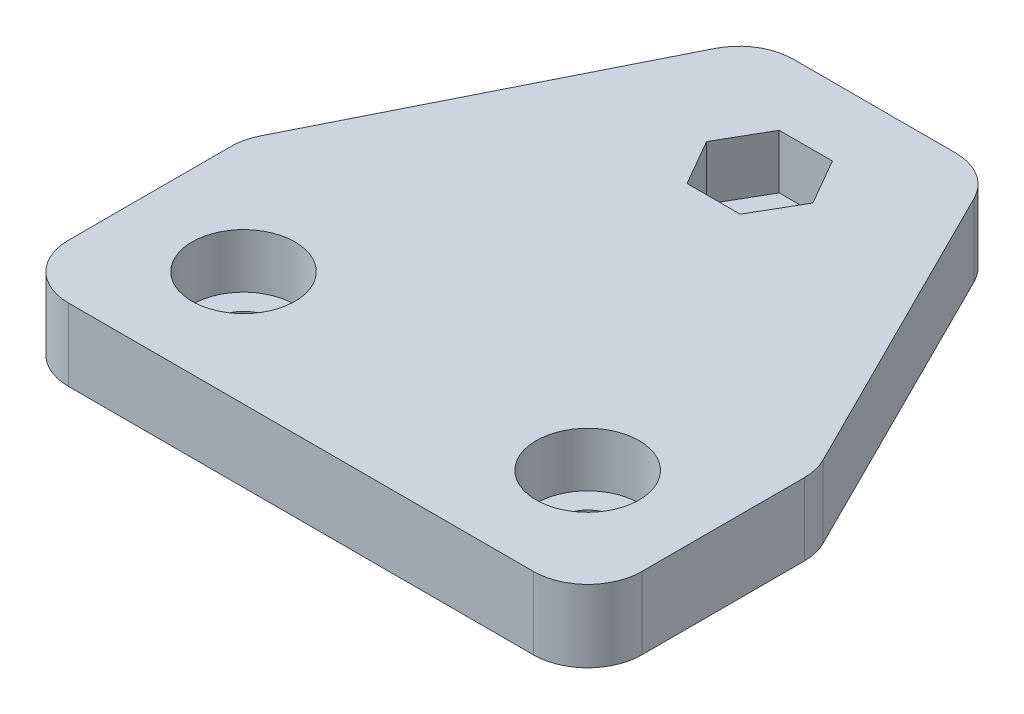
ISO-10303-21;
HEADER;
FILE_DESCRIPTION(('STEP AP214'),'2;1');
FILE_NAME('part.step','',(''),(''),'','','');
FILE_SCHEMA(('AUTOMOTIVE_DESIGN { 1 0 10303 214 1 1 1 1 }'));
ENDSEC;
DATA;
#1=APPLICATION_CONTEXT('core data for automotive mechanical design processes');
#2=APPLICATION_PROTOCOL_DEFINITION('international standard','automotive_design',2000,#1);
#3=PRODUCT_CONTEXT('',#1,'mechanical');
#4=PRODUCT('Part','Part','',(#3));
#5=PRODUCT_RELATED_PRODUCT_CATEGORY('part','',(#4));
#6=PRODUCT_DEFINITION_FORMATION('','',#4);
#7=PRODUCT_DEFINITION_CONTEXT('part definition',#1,'design');
#8=PRODUCT_DEFINITION('design','',#6,#7);
#9=PRODUCT_DEFINITION_SHAPE('','',#8);
#10=(LENGTH_UNIT() NAMED_UNIT(*) SI_UNIT(.MILLI.,.METRE.));
#11=(NAMED_UNIT(*) PLANE_ANGLE_UNIT() SI_UNIT($,.RADIAN.));
#12=(NAMED_UNIT(*) SI_UNIT($,.STERADIAN.) SOLID_ANGLE_UNIT());
#13=UNCERTAINTY_MEASURE_WITH_UNIT(LENGTH_MEASURE(1.E-05),#10,'distance_accuracy_value','');
#14=(GEOMETRIC_REPRESENTATION_CONTEXT(3) GLOBAL_UNCERTAINTY_ASSIGNED_CONTEXT((#13)) GLOBAL_UNIT_ASSIGNED_CONTEXT((#10,
#11,#12)) REPRESENTATION_CONTEXT('',''));
#15=CARTESIAN_POINT('',(0.,0.,0.));
#16=DIRECTION('',(0.,0.,1.));
#17=DIRECTION('',(1.,0.,0.));
#18=AXIS2_PLACEMENT_3D('',#15,#16,#17);
#19=CARTESIAN_POINT('',(0.,0.,-50.8));
#20=DIRECTION('',(0.,1.,0.));
#21=DIRECTION('',(0.,0.,1.));
#22=AXIS2_PLACEMENT_3D('',#19,#20,#21);
#23=CYLINDRICAL_SURFACE('',#22,3.1);
#24=CARTESIAN_POINT('',(0.,0.,-50.8));
#25=DIRECTION('',(0.,1.,0.));
#26=DIRECTION('',(0.,0.,1.));
#27=AXIS2_PLACEMENT_3D('',#24,#25,#26);
#28=CIRCLE('',#27,3.1);
#29=CARTESIAN_POINT('',(0.,0.,-47.7));
#30=VERTEX_POINT('',#29);
#31=EDGE_CURVE('E213',#30,#30,#28,.T.);
#32=ORIENTED_EDGE('',*,*,#31,.F.);
#33=EDGE_LOOP('',(#32));
#34=FACE_BOUND('',#33,.T.);
#35=CARTESIAN_POINT('',(0.,2.,-50.8));
#36=DIRECTION('',(0.,1.,0.));
#37=DIRECTION('',(0.,0.,1.));
#38=AXIS2_PLACEMENT_3D('',#35,#36,#37);
#39=CIRCLE('',#38,3.1);
#40=CARTESIAN_POINT('',(0.,2.,-47.7));
#41=VERTEX_POINT('',#40);
#42=EDGE_CURVE('E308',#41,#41,#39,.F.);
#43=ORIENTED_EDGE('',*,*,#42,.F.);
#44=EDGE_LOOP('',(#43));
#45=FACE_BOUND('',#44,.T.);
#46=ADVANCED_FACE('F41',(#34,#45),#23,.F.);
#47=CARTESIAN_POINT('',(19.05,0.,-12.7));
#48=DIRECTION('',(0.,1.,0.));
#49=DIRECTION('',(0.,0.,1.));
#50=AXIS2_PLACEMENT_3D('',#47,#48,#49);
#51=CYLINDRICAL_SURFACE('',#50,3.1);
#52=CARTESIAN_POINT('',(19.05,0.,-12.7));
#53=DIRECTION('',(0.,1.,0.));
#54=DIRECTION('',(0.,0.,1.));
#55=AXIS2_PLACEMENT_3D('',#52,#53,#54);
#56=CIRCLE('',#55,3.1);
#57=CARTESIAN_POINT('',(19.05,0.,-9.6));
#58=VERTEX_POINT('',#57);
#59=EDGE_CURVE('E210',#58,#58,#56,.T.);
#60=ORIENTED_EDGE('',*,*,#59,.F.);
#61=EDGE_LOOP('',(#60));
#62=FACE_BOUND('',#61,.T.);
#63=CARTESIAN_POINT('',(19.05,2.,-12.7));
#64=DIRECTION('',(0.,1.,0.));
#65=DIRECTION('',(0.,0.,1.));
#66=AXIS2_PLACEMENT_3D('',#63,#64,#65);
#67=CIRCLE('',#66,3.1);
#68=CARTESIAN_POINT('',(19.05,2.,-9.6));
#69=VERTEX_POINT('',#68);
#70=EDGE_CURVE('E305',#69,#69,#67,.F.);
#71=ORIENTED_EDGE('',*,*,#70,.F.);
#72=EDGE_LOOP('',(#71));
#73=FACE_BOUND('',#72,.T.);
#74=ADVANCED_FACE('F358',(#62,#73),#51,.F.);
#75=CARTESIAN_POINT('',(-19.05,0.,-12.7));
#76=DIRECTION('',(0.,1.,0.));
#77=DIRECTION('',(0.,0.,1.));
#78=AXIS2_PLACEMENT_3D('',#75,#76,#77);
#79=CYLINDRICAL_SURFACE('',#78,3.1);
#80=CARTESIAN_POINT('',(-19.05,0.,-12.7));
#81=DIRECTION('',(0.,1.,0.));
#82=DIRECTION('',(0.,0.,1.));
#83=AXIS2_PLACEMENT_3D('',#80,#81,#82);
#84=CIRCLE('',#83,3.1);
#85=CARTESIAN_POINT('',(-19.05,0.,-9.6));
#86=VERTEX_POINT('',#85);
#87=EDGE_CURVE('E206',#86,#86,#84,.T.);
#88=ORIENTED_EDGE('',*,*,#87,.F.);
#89=EDGE_LOOP('',(#88));
#90=FACE_BOUND('',#89,.T.);
#91=CARTESIAN_POINT('',(-19.05,2.,-12.7));
#92=DIRECTION('',(0.,1.,0.));
#93=DIRECTION('',(0.,0.,1.));
#94=AXIS2_PLACEMENT_3D('',#91,#92,#93);
#95=CIRCLE('',#94,3.1);
#96=CARTESIAN_POINT('',(-19.05,2.,-9.6));
#97=VERTEX_POINT('',#96);
#98=EDGE_CURVE('E302',#97,#97,#95,.F.);
#99=ORIENTED_EDGE('',*,*,#98,.F.);
#100=EDGE_LOOP('',(#99));
#101=FACE_BOUND('',#100,.T.);
#102=ADVANCED_FACE('F365',(#90,#101),#79,.F.);
#103=CARTESIAN_POINT('',(31.75,8.,-25.4));
#104=DIRECTION('',(-1.,0.,0.));
#105=DIRECTION('',(0.,0.,1.));
#106=AXIS2_PLACEMENT_3D('',#103,#104,#105);
#107=PLANE('',#106);
#108=DIRECTION('',(0.,0.,-1.));
#109=VECTOR('',#108,1.);
#110=CARTESIAN_POINT('',(31.75,0.,-25.4));
#111=LINE('',#110,#109);
#112=CARTESIAN_POINT('',(31.75,0.,-6.));
#113=VERTEX_POINT('',#112);
#114=CARTESIAN_POINT('',(31.75,0.,-23.9835921350013));
#115=VERTEX_POINT('',#114);
#116=EDGE_CURVE('E209',#113,#115,#111,.T.);
#117=ORIENTED_EDGE('',*,*,#116,.T.);
#118=DIRECTION('',(0.,-1.,0.));
#119=VECTOR('',#118,1.);
#120=CARTESIAN_POINT('',(31.75,8.,-23.9835921350013));
#121=LINE('',#120,#119);
#122=CARTESIAN_POINT('',(31.75,8.,-23.9835921350013));
#123=VERTEX_POINT('',#122);
#124=EDGE_CURVE('E291',#115,#123,#121,.F.);
#125=ORIENTED_EDGE('',*,*,#124,.T.);
#126=DIRECTION('',(0.,0.,-1.));
#127=VECTOR('',#126,1.);
#128=CARTESIAN_POINT('',(31.75,8.,-25.4));
#129=LINE('',#128,#127);
#130=CARTESIAN_POINT('',(31.75,8.,-6.));
#131=VERTEX_POINT('',#130);
#132=EDGE_CURVE('E216',#131,#123,#129,.T.);
#133=ORIENTED_EDGE('',*,*,#132,.F.);
#134=DIRECTION('',(0.,-1.,0.));
#135=VECTOR('',#134,1.);
#136=CARTESIAN_POINT('',(31.75,8.,-6.));
#137=LINE('',#136,#135);
#138=EDGE_CURVE('E288',#131,#113,#137,.T.);
#139=ORIENTED_EDGE('',*,*,#138,.T.);
#140=EDGE_LOOP('',(#117,#125,#133,#139));
#141=FACE_BOUND('',#140,.T.);
#142=ADVANCED_FACE('F398',(#141),#107,.F.);
#143=CARTESIAN_POINT('',(12.7,8.,-63.5));
#144=DIRECTION('',(-0.894427190999916,0.,0.447213595499958));
#145=DIRECTION('',(0.447213595499958,0.,0.894427190999916));
#146=AXIS2_PLACEMENT_3D('',#143,#144,#145);
#147=PLANE('',#146);
#148=DIRECTION('',(-0.447213595499958,0.,-0.894427190999916));
#149=VECTOR('',#148,1.);
#150=CARTESIAN_POINT('',(12.7,0.,-63.5));
#151=LINE('',#150,#149);
#152=CARTESIAN_POINT('',(31.1165631459995,0.,-26.666873708001));
#153=VERTEX_POINT('',#152);
#154=CARTESIAN_POINT('',(14.3583592135001,0.,-60.1832815729998));
#155=VERTEX_POINT('',#154);
#156=EDGE_CURVE('E237',#153,#155,#151,.T.);
#157=ORIENTED_EDGE('',*,*,#156,.T.);
#158=DIRECTION('',(0.,-1.,0.));
#159=VECTOR('',#158,1.);
#160=CARTESIAN_POINT('',(14.3583592135001,8.,-60.1832815729998));
#161=LINE('',#160,#159);
#162=CARTESIAN_POINT('',(14.3583592135001,8.,-60.1832815729998));
#163=VERTEX_POINT('',#162);
#164=EDGE_CURVE('E286',#155,#163,#161,.F.);
#165=ORIENTED_EDGE('',*,*,#164,.T.);
#166=DIRECTION('',(-0.447213595499958,0.,-0.894427190999916));
#167=VECTOR('',#166,1.);
#168=CARTESIAN_POINT('',(12.7,8.,-63.5));
#169=LINE('',#168,#167);
#170=CARTESIAN_POINT('',(31.1165631459995,8.,-26.666873708001));
#171=VERTEX_POINT('',#170);
#172=EDGE_CURVE('E219',#171,#163,#169,.T.);
#173=ORIENTED_EDGE('',*,*,#172,.F.);
#174=DIRECTION('',(0.,-1.,0.));
#175=VECTOR('',#174,1.);
#176=CARTESIAN_POINT('',(31.1165631459995,8.,-26.666873708001));
#177=LINE('',#176,#175);
#178=EDGE_CURVE('E283',#171,#153,#177,.T.);
#179=ORIENTED_EDGE('',*,*,#178,.T.);
#180=EDGE_LOOP('',(#157,#165,#173,#179));
#181=FACE_BOUND('',#180,.T.);
#182=ADVANCED_FACE('F394',(#181),#147,.F.);
#183=CARTESIAN_POINT('',(-12.7,8.,-63.5));
#184=DIRECTION('',(0.,0.,1.));
#185=DIRECTION('',(1.,0.,0.));
#186=AXIS2_PLACEMENT_3D('',#183,#184,#185);
#187=PLANE('',#186);
#188=DIRECTION('',(-1.,0.,0.));
#189=VECTOR('',#188,1.);
#190=CARTESIAN_POINT('',(-12.7,0.,-63.5));
#191=LINE('',#190,#189);
#192=CARTESIAN_POINT('',(8.99179606750063,0.,-63.5));
#193=VERTEX_POINT('',#192);
#194=CARTESIAN_POINT('',(-8.99179606750063,0.,-63.5));
#195=VERTEX_POINT('',#194);
#196=EDGE_CURVE('E240',#193,#195,#191,.T.);
#197=ORIENTED_EDGE('',*,*,#196,.T.);
#198=DIRECTION('',(0.,-1.,0.));
#199=VECTOR('',#198,1.);
#200=CARTESIAN_POINT('',(-8.99179606750063,8.,-63.5));
#201=LINE('',#200,#199);
#202=CARTESIAN_POINT('',(-8.99179606750063,8.,-63.5));
#203=VERTEX_POINT('',#202);
#204=EDGE_CURVE('E269',#195,#203,#201,.F.);
#205=ORIENTED_EDGE('',*,*,#204,.T.);
#206=DIRECTION('',(-1.,0.,0.));
#207=VECTOR('',#206,1.);
#208=CARTESIAN_POINT('',(-12.7,8.,-63.5));
#209=LINE('',#208,#207);
#210=CARTESIAN_POINT('',(8.99179606750063,8.,-63.5));
#211=VERTEX_POINT('',#210);
#212=EDGE_CURVE('E223',#211,#203,#209,.T.);
#213=ORIENTED_EDGE('',*,*,#212,.F.);
#214=DIRECTION('',(0.,-1.,0.));
#215=VECTOR('',#214,1.);
#216=CARTESIAN_POINT('',(8.99179606750063,8.,-63.5));
#217=LINE('',#216,#215);
#218=EDGE_CURVE('E266',#211,#193,#217,.T.);
#219=ORIENTED_EDGE('',*,*,#218,.T.);
#220=EDGE_LOOP('',(#197,#205,#213,#219));
#221=FACE_BOUND('',#220,.T.);
#222=ADVANCED_FACE('F390',(#221),#187,.F.);
#223=CARTESIAN_POINT('',(-31.75,8.,-25.4));
#224=DIRECTION('',(0.894427190999916,0.,0.447213595499958));
#225=DIRECTION('',(0.447213595499958,0.,-0.894427190999916));
#226=AXIS2_PLACEMENT_3D('',#223,#224,#225);
#227=PLANE('',#226);
#228=DIRECTION('',(-0.447213595499958,0.,0.894427190999916));
#229=VECTOR('',#228,1.);
#230=CARTESIAN_POINT('',(-31.75,8.,-25.4));
#231=LINE('',#230,#229);
#232=CARTESIAN_POINT('',(-14.3583592135001,8.,-60.1832815729998));
#233=VERTEX_POINT('',#232);
#234=CARTESIAN_POINT('',(-31.1165631459995,8.,-26.666873708001));
#235=VERTEX_POINT('',#234);
#236=EDGE_CURVE('E226',#233,#235,#231,.T.);
#237=ORIENTED_EDGE('',*,*,#236,.F.);
#238=DIRECTION('',(0.,-1.,0.));
#239=VECTOR('',#238,1.);
#240=CARTESIAN_POINT('',(-14.3583592135001,8.,-60.1832815729998));
#241=LINE('',#240,#239);
#242=CARTESIAN_POINT('',(-14.3583592135001,0.,-60.1832815729998));
#243=VERTEX_POINT('',#242);
#244=EDGE_CURVE('E251',#233,#243,#241,.T.);
#245=ORIENTED_EDGE('',*,*,#244,.T.);
#246=DIRECTION('',(-0.447213595499958,0.,0.894427190999916));
#247=VECTOR('',#246,1.);
#248=CARTESIAN_POINT('',(-31.75,0.,-25.4));
#249=LINE('',#248,#247);
#250=CARTESIAN_POINT('',(-31.1165631459995,0.,-26.666873708001));
#251=VERTEX_POINT('',#250);
#252=EDGE_CURVE('E243',#243,#251,#249,.T.);
#253=ORIENTED_EDGE('',*,*,#252,.T.);
#254=DIRECTION('',(0.,-1.,0.));
#255=VECTOR('',#254,1.);
#256=CARTESIAN_POINT('',(-31.1165631459995,8.,-26.666873708001));
#257=LINE('',#256,#255);
#258=EDGE_CURVE('E234',#251,#235,#257,.F.);
#259=ORIENTED_EDGE('',*,*,#258,.T.);
#260=EDGE_LOOP('',(#237,#245,#253,#259));
#261=FACE_BOUND('',#260,.T.);
#262=ADVANCED_FACE('F386',(#261),#227,.F.);
#263=CARTESIAN_POINT('',(-31.75,8.,0.));
#264=DIRECTION('',(1.,0.,0.));
#265=DIRECTION('',(0.,0.,-1.));
#266=AXIS2_PLACEMENT_3D('',#263,#264,#265);
#267=PLANE('',#266);
#268=DIRECTION('',(0.,0.,1.));
#269=VECTOR('',#268,1.);
#270=CARTESIAN_POINT('',(-31.75,0.,0.));
#271=LINE('',#270,#269);
#272=CARTESIAN_POINT('',(-31.75,0.,-23.9835921350013));
#273=VERTEX_POINT('',#272);
#274=CARTESIAN_POINT('',(-31.75,0.,-6.));
#275=VERTEX_POINT('',#274);
#276=EDGE_CURVE('E246',#273,#275,#271,.T.);
#277=ORIENTED_EDGE('',*,*,#276,.T.);
#278=DIRECTION('',(0.,-1.,0.));
#279=VECTOR('',#278,1.);
#280=CARTESIAN_POINT('',(-31.75,8.,-6.));
#281=LINE('',#280,#279);
#282=CARTESIAN_POINT('',(-31.75,8.,-6.));
#283=VERTEX_POINT('',#282);
#284=EDGE_CURVE('E300',#275,#283,#281,.F.);
#285=ORIENTED_EDGE('',*,*,#284,.T.);
#286=DIRECTION('',(0.,0.,1.));
#287=VECTOR('',#286,1.);
#288=CARTESIAN_POINT('',(-31.75,8.,0.));
#289=LINE('',#288,#287);
#290=CARTESIAN_POINT('',(-31.75,8.,-23.9835921350013));
#291=VERTEX_POINT('',#290);
#292=EDGE_CURVE('E229',#291,#283,#289,.T.);
#293=ORIENTED_EDGE('',*,*,#292,.F.);
#294=DIRECTION('',(0.,-1.,0.));
#295=VECTOR('',#294,1.);
#296=CARTESIAN_POINT('',(-31.75,8.,-23.9835921350013));
#297=LINE('',#296,#295);
#298=EDGE_CURVE('E297',#291,#273,#297,.T.);
#299=ORIENTED_EDGE('',*,*,#298,.T.);
#300=EDGE_LOOP('',(#277,#285,#293,#299));
#301=FACE_BOUND('',#300,.T.);
#302=ADVANCED_FACE('F383',(#301),#267,.F.);
#303=CARTESIAN_POINT('',(-31.75,8.,0.));
#304=DIRECTION('',(0.,0.,-1.));
#305=DIRECTION('',(-1.,0.,0.));
#306=AXIS2_PLACEMENT_3D('',#303,#304,#305);
#307=PLANE('',#306);
#308=DIRECTION('',(1.,0.,0.));
#309=VECTOR('',#308,1.);
#310=CARTESIAN_POINT('',(-31.75,0.,0.));
#311=LINE('',#310,#309);
#312=CARTESIAN_POINT('',(-25.75,0.,0.));
#313=VERTEX_POINT('',#312);
#314=CARTESIAN_POINT('',(25.75,0.,0.));
#315=VERTEX_POINT('',#314);
#316=EDGE_CURVE('E220',#313,#315,#311,.T.);
#317=ORIENTED_EDGE('',*,*,#316,.T.);
#318=DIRECTION('',(0.,-1.,0.));
#319=VECTOR('',#318,1.);
#320=CARTESIAN_POINT('',(25.75,8.,0.));
#321=LINE('',#320,#319);
#322=CARTESIAN_POINT('',(25.75,8.,0.));
#323=VERTEX_POINT('',#322);
#324=EDGE_CURVE('E65',#315,#323,#321,.F.);
#325=ORIENTED_EDGE('',*,*,#324,.T.);
#326=DIRECTION('',(1.,0.,0.));
#327=VECTOR('',#326,1.);
#328=CARTESIAN_POINT('',(-31.75,8.,0.));
#329=LINE('',#328,#327);
#330=CARTESIAN_POINT('',(-25.75,8.,0.));
#331=VERTEX_POINT('',#330);
#332=EDGE_CURVE('E232',#331,#323,#329,.T.);
#333=ORIENTED_EDGE('',*,*,#332,.F.);
#334=DIRECTION('',(0.,-1.,0.));
#335=VECTOR('',#334,1.);
#336=CARTESIAN_POINT('',(-25.75,8.,0.));
#337=LINE('',#336,#335);
#338=EDGE_CURVE('E293',#331,#313,#337,.T.);
#339=ORIENTED_EDGE('',*,*,#338,.T.);
#340=EDGE_LOOP('',(#317,#325,#333,#339));
#341=FACE_BOUND('',#340,.T.);
#342=ADVANCED_FACE('F375',(#341),#307,.F.);
#343=CARTESIAN_POINT('',(0.,8.,0.));
#344=DIRECTION('',(0.,1.,0.));
#345=DIRECTION('',(0.,0.,1.));
#346=AXIS2_PLACEMENT_3D('',#343,#344,#345);
#347=PLANE('',#346);
#348=CARTESIAN_POINT('',(-19.05,8.,-12.7));
#349=DIRECTION('',(0.,1.,0.));
#350=DIRECTION('',(0.,0.,1.));
#351=AXIS2_PLACEMENT_3D('',#348,#349,#350);
#352=CIRCLE('',#351,5.7);
#353=CARTESIAN_POINT('',(-19.05,8.,-18.4));
#354=VERTEX_POINT('',#353);
#355=EDGE_CURVE('E45',#354,#354,#352,.F.);
#356=ORIENTED_EDGE('',*,*,#355,.T.);
#357=EDGE_LOOP('',(#356));
#358=FACE_BOUND('',#357,.T.);
#359=DIRECTION('',(0.500000000000001,0.,0.866025403784438));
#360=VECTOR('',#359,1.);
#361=CARTESIAN_POINT('',(26.4137748154254,8.,-15.25));
#362=LINE('',#361,#360);
#363=CARTESIAN_POINT('',(2.9444863728671,8.,-55.9));
#364=VERTEX_POINT('',#363);
#365=CARTESIAN_POINT('',(5.88897274573419,8.,-50.8));
#366=VERTEX_POINT('',#365);
#367=EDGE_CURVE('E50',#364,#366,#362,.T.);
#368=ORIENTED_EDGE('',*,*,#367,.T.);
#369=DIRECTION('',(-0.5,0.,0.866025403784439));
#370=VECTOR('',#369,1.);
#371=CARTESIAN_POINT('',(-17.5803156968241,8.,-10.15));
#372=LINE('',#371,#370);
#373=CARTESIAN_POINT('',(2.9444863728671,8.,-45.7));
#374=VERTEX_POINT('',#373);
#375=EDGE_CURVE('E11',#366,#374,#372,.T.);
#376=ORIENTED_EDGE('',*,*,#375,.T.);
#377=DIRECTION('',(-1.,0.,0.));
#378=VECTOR('',#377,1.);
#379=CARTESIAN_POINT('',(0.,8.,-45.7));
#380=LINE('',#379,#378);
#381=CARTESIAN_POINT('',(-2.9444863728671,8.,-45.7));
#382=VERTEX_POINT('',#381);
#383=EDGE_CURVE('E173',#374,#382,#380,.T.);
#384=ORIENTED_EDGE('',*,*,#383,.T.);
#385=DIRECTION('',(-0.5,0.,-0.866025403784439));
#386=VECTOR('',#385,1.);
#387=CARTESIAN_POINT('',(17.5803156968241,8.,-10.15));
#388=LINE('',#387,#386);
#389=CARTESIAN_POINT('',(-5.88897274573418,8.,-50.8));
#390=VERTEX_POINT('',#389);
#391=EDGE_CURVE('E315',#382,#390,#388,.T.);
#392=ORIENTED_EDGE('',*,*,#391,.T.);
#393=DIRECTION('',(0.5,0.,-0.866025403784439));
#394=VECTOR('',#393,1.);
#395=CARTESIAN_POINT('',(-26.4137748154254,8.,-15.25));
#396=LINE('',#395,#394);
#397=CARTESIAN_POINT('',(-2.94448637286709,8.,-55.9));
#398=VERTEX_POINT('',#397);
#399=EDGE_CURVE('E318',#390,#398,#396,.T.);
#400=ORIENTED_EDGE('',*,*,#399,.T.);
#401=DIRECTION('',(1.,0.,0.));
#402=VECTOR('',#401,1.);
#403=CARTESIAN_POINT('',(0.,8.,-55.9));
#404=LINE('',#403,#402);
#405=EDGE_CURVE('E321',#398,#364,#404,.T.);
#406=ORIENTED_EDGE('',*,*,#405,.T.);
#407=EDGE_LOOP('',(#368,#376,#384,#392,#400,#406));
#408=FACE_BOUND('',#407,.T.);
#409=CARTESIAN_POINT('',(19.05,8.,-12.7));
#410=DIRECTION('',(0.,1.,0.));
#411=DIRECTION('',(0.,0.,1.));
#412=AXIS2_PLACEMENT_3D('',#409,#410,#411);
#413=CIRCLE('',#412,5.7);
#414=CARTESIAN_POINT('',(19.05,8.,-18.4));
#415=VERTEX_POINT('',#414);
#416=EDGE_CURVE('E311',#415,#415,#413,.F.);
#417=ORIENTED_EDGE('',*,*,#416,.T.);
#418=EDGE_LOOP('',(#417));
#419=FACE_BOUND('',#418,.T.);
#420=ORIENTED_EDGE('',*,*,#212,.T.);
#421=CARTESIAN_POINT('',(-8.99179606750063,8.,-57.5));
#422=DIRECTION('',(0.,1.,0.));
#423=DIRECTION('',(0.,0.,1.));
#424=AXIS2_PLACEMENT_3D('',#421,#422,#423);
#425=CIRCLE('',#424,6.);
#426=EDGE_CURVE('E281',#203,#233,#425,.T.);
#427=ORIENTED_EDGE('',*,*,#426,.T.);
#428=ORIENTED_EDGE('',*,*,#236,.T.);
#429=CARTESIAN_POINT('',(-25.75,8.,-23.9835921350013));
#430=DIRECTION('',(0.,1.,0.));
#431=DIRECTION('',(0.,0.,1.));
#432=AXIS2_PLACEMENT_3D('',#429,#430,#431);
#433=CIRCLE('',#432,6.);
#434=EDGE_CURVE('E271',#235,#291,#433,.T.);
#435=ORIENTED_EDGE('',*,*,#434,.T.);
#436=ORIENTED_EDGE('',*,*,#292,.T.);
#437=CARTESIAN_POINT('',(-25.75,8.,-6.));
#438=DIRECTION('',(0.,1.,0.));
#439=DIRECTION('',(0.,0.,1.));
#440=AXIS2_PLACEMENT_3D('',#437,#438,#439);
#441=CIRCLE('',#440,6.);
#442=EDGE_CURVE('E273',#283,#331,#441,.T.);
#443=ORIENTED_EDGE('',*,*,#442,.T.);
#444=ORIENTED_EDGE('',*,*,#332,.T.);
#445=CARTESIAN_POINT('',(25.75,8.,-6.));
#446=DIRECTION('',(0.,1.,0.));
#447=DIRECTION('',(0.,0.,1.));
#448=AXIS2_PLACEMENT_3D('',#445,#446,#447);
#449=CIRCLE('',#448,6.);
#450=EDGE_CURVE('E275',#323,#131,#449,.T.);
#451=ORIENTED_EDGE('',*,*,#450,.T.);
#452=ORIENTED_EDGE('',*,*,#132,.T.);
#453=CARTESIAN_POINT('',(25.75,8.,-23.9835921350013));
#454=DIRECTION('',(0.,1.,0.));
#455=DIRECTION('',(0.,0.,1.));
#456=AXIS2_PLACEMENT_3D('',#453,#454,#455);
#457=CIRCLE('',#456,6.);
#458=EDGE_CURVE('E277',#123,#171,#457,.T.);
#459=ORIENTED_EDGE('',*,*,#458,.T.);
#460=ORIENTED_EDGE('',*,*,#172,.T.);
#461=CARTESIAN_POINT('',(8.99179606750063,8.,-57.5));
#462=DIRECTION('',(0.,1.,0.));
#463=DIRECTION('',(0.,0.,1.));
#464=AXIS2_PLACEMENT_3D('',#461,#462,#463);
#465=CIRCLE('',#464,6.);
#466=EDGE_CURVE('E279',#163,#211,#465,.T.);
#467=ORIENTED_EDGE('',*,*,#466,.T.);
#468=EDGE_LOOP('',(#420,#427,#428,#435,#436,#443,#444,#451,#452,#459,#460,#467));
#469=FACE_BOUND('',#468,.T.);
#470=ADVANCED_FACE('F326',(#358,#408,#419,#469),#347,.T.);
#471=CARTESIAN_POINT('',(0.,0.,0.));
#472=DIRECTION('',(0.,1.,0.));
#473=DIRECTION('',(0.,0.,1.));
#474=AXIS2_PLACEMENT_3D('',#471,#472,#473);
#475=PLANE('',#474);
#476=ORIENTED_EDGE('',*,*,#87,.T.);
#477=EDGE_LOOP('',(#476));
#478=FACE_BOUND('',#477,.T.);
#479=ORIENTED_EDGE('',*,*,#59,.T.);
#480=EDGE_LOOP('',(#479));
#481=FACE_BOUND('',#480,.T.);
#482=ORIENTED_EDGE('',*,*,#31,.T.);
#483=EDGE_LOOP('',(#482));
#484=FACE_BOUND('',#483,.T.);
#485=ORIENTED_EDGE('',*,*,#252,.F.);
#486=CARTESIAN_POINT('',(-8.99179606750063,0.,-57.5));
#487=DIRECTION('',(0.,1.,0.));
#488=DIRECTION('',(0.,0.,1.));
#489=AXIS2_PLACEMENT_3D('',#486,#487,#488);
#490=CIRCLE('',#489,6.);
#491=EDGE_CURVE('E264',#243,#195,#490,.F.);
#492=ORIENTED_EDGE('',*,*,#491,.T.);
#493=ORIENTED_EDGE('',*,*,#196,.F.);
#494=CARTESIAN_POINT('',(8.99179606750063,0.,-57.5));
#495=DIRECTION('',(0.,1.,0.));
#496=DIRECTION('',(0.,0.,1.));
#497=AXIS2_PLACEMENT_3D('',#494,#495,#496);
#498=CIRCLE('',#497,6.);
#499=EDGE_CURVE('E262',#193,#155,#498,.F.);
#500=ORIENTED_EDGE('',*,*,#499,.T.);
#501=ORIENTED_EDGE('',*,*,#156,.F.);
#502=CARTESIAN_POINT('',(25.75,0.,-23.9835921350013));
#503=DIRECTION('',(0.,1.,0.));
#504=DIRECTION('',(0.,0.,1.));
#505=AXIS2_PLACEMENT_3D('',#502,#503,#504);
#506=CIRCLE('',#505,6.);
#507=EDGE_CURVE('E260',#153,#115,#506,.F.);
#508=ORIENTED_EDGE('',*,*,#507,.T.);
#509=ORIENTED_EDGE('',*,*,#116,.F.);
#510=CARTESIAN_POINT('',(25.75,0.,-6.));
#511=DIRECTION('',(0.,1.,0.));
#512=DIRECTION('',(0.,0.,1.));
#513=AXIS2_PLACEMENT_3D('',#510,#511,#512);
#514=CIRCLE('',#513,6.);
#515=EDGE_CURVE('E258',#113,#315,#514,.F.);
#516=ORIENTED_EDGE('',*,*,#515,.T.);
#517=ORIENTED_EDGE('',*,*,#316,.F.);
#518=CARTESIAN_POINT('',(-25.75,0.,-6.));
#519=DIRECTION('',(0.,1.,0.));
#520=DIRECTION('',(0.,0.,1.));
#521=AXIS2_PLACEMENT_3D('',#518,#519,#520);
#522=CIRCLE('',#521,6.);
#523=EDGE_CURVE('E256',#313,#275,#522,.F.);
#524=ORIENTED_EDGE('',*,*,#523,.T.);
#525=ORIENTED_EDGE('',*,*,#276,.F.);
#526=CARTESIAN_POINT('',(-25.75,0.,-23.9835921350013));
#527=DIRECTION('',(0.,1.,0.));
#528=DIRECTION('',(0.,0.,1.));
#529=AXIS2_PLACEMENT_3D('',#526,#527,#528);
#530=CIRCLE('',#529,6.);
#531=EDGE_CURVE('E254',#273,#251,#530,.F.);
#532=ORIENTED_EDGE('',*,*,#531,.T.);
#533=EDGE_LOOP('',(#485,#492,#493,#500,#501,#508,#509,#516,#517,#524,#525,#532));
#534=FACE_BOUND('',#533,.T.);
#535=ADVANCED_FACE('F374',(#478,#481,#484,#534),#475,.F.);
#536=CARTESIAN_POINT('',(-8.99179606750063,8.,-57.5));
#537=DIRECTION('',(0.,-1.,0.));
#538=DIRECTION('',(0.,0.,-1.));
#539=AXIS2_PLACEMENT_3D('',#536,#537,#538);
#540=CYLINDRICAL_SURFACE('',#539,6.);
#541=ORIENTED_EDGE('',*,*,#426,.F.);
#542=ORIENTED_EDGE('',*,*,#204,.F.);
#543=ORIENTED_EDGE('',*,*,#491,.F.);
#544=ORIENTED_EDGE('',*,*,#244,.F.);
#545=EDGE_LOOP('',(#541,#542,#543,#544));
#546=FACE_BOUND('',#545,.T.);
#547=ADVANCED_FACE('F379',(#546),#540,.T.);
#548=CARTESIAN_POINT('',(8.99179606750063,8.,-57.5));
#549=DIRECTION('',(0.,-1.,0.));
#550=DIRECTION('',(0.,0.,-1.));
#551=AXIS2_PLACEMENT_3D('',#548,#549,#550);
#552=CYLINDRICAL_SURFACE('',#551,6.);
#553=ORIENTED_EDGE('',*,*,#466,.F.);
#554=ORIENTED_EDGE('',*,*,#164,.F.);
#555=ORIENTED_EDGE('',*,*,#499,.F.);
#556=ORIENTED_EDGE('',*,*,#218,.F.);
#557=EDGE_LOOP('',(#553,#554,#555,#556));
#558=FACE_BOUND('',#557,.T.);
#559=ADVANCED_FACE('F405',(#558),#552,.T.);
#560=CARTESIAN_POINT('',(25.75,8.,-23.9835921350013));
#561=DIRECTION('',(0.,-1.,0.));
#562=DIRECTION('',(0.,0.,-1.));
#563=AXIS2_PLACEMENT_3D('',#560,#561,#562);
#564=CYLINDRICAL_SURFACE('',#563,6.);
#565=ORIENTED_EDGE('',*,*,#458,.F.);
#566=ORIENTED_EDGE('',*,*,#124,.F.);
#567=ORIENTED_EDGE('',*,*,#507,.F.);
#568=ORIENTED_EDGE('',*,*,#178,.F.);
#569=EDGE_LOOP('',(#565,#566,#567,#568));
#570=FACE_BOUND('',#569,.T.);
#571=ADVANCED_FACE('F409',(#570),#564,.T.);
#572=CARTESIAN_POINT('',(25.75,8.,-6.));
#573=DIRECTION('',(0.,-1.,0.));
#574=DIRECTION('',(0.,0.,-1.));
#575=AXIS2_PLACEMENT_3D('',#572,#573,#574);
#576=CYLINDRICAL_SURFACE('',#575,6.);
#577=ORIENTED_EDGE('',*,*,#450,.F.);
#578=ORIENTED_EDGE('',*,*,#324,.F.);
#579=ORIENTED_EDGE('',*,*,#515,.F.);
#580=ORIENTED_EDGE('',*,*,#138,.F.);
#581=EDGE_LOOP('',(#577,#578,#579,#580));
#582=FACE_BOUND('',#581,.T.);
#583=ADVANCED_FACE('F413',(#582),#576,.T.);
#584=CARTESIAN_POINT('',(-25.75,8.,-6.));
#585=DIRECTION('',(0.,-1.,0.));
#586=DIRECTION('',(0.,0.,-1.));
#587=AXIS2_PLACEMENT_3D('',#584,#585,#586);
#588=CYLINDRICAL_SURFACE('',#587,6.);
#589=ORIENTED_EDGE('',*,*,#442,.F.);
#590=ORIENTED_EDGE('',*,*,#284,.F.);
#591=ORIENTED_EDGE('',*,*,#523,.F.);
#592=ORIENTED_EDGE('',*,*,#338,.F.);
#593=EDGE_LOOP('',(#589,#590,#591,#592));
#594=FACE_BOUND('',#593,.T.);
#595=ADVANCED_FACE('F416',(#594),#588,.T.);
#596=CARTESIAN_POINT('',(-25.75,8.,-23.9835921350013));
#597=DIRECTION('',(0.,-1.,0.));
#598=DIRECTION('',(0.,0.,-1.));
#599=AXIS2_PLACEMENT_3D('',#596,#597,#598);
#600=CYLINDRICAL_SURFACE('',#599,6.);
#601=ORIENTED_EDGE('',*,*,#434,.F.);
#602=ORIENTED_EDGE('',*,*,#258,.F.);
#603=ORIENTED_EDGE('',*,*,#531,.F.);
#604=ORIENTED_EDGE('',*,*,#298,.F.);
#605=EDGE_LOOP('',(#601,#602,#603,#604));
#606=FACE_BOUND('',#605,.T.);
#607=ADVANCED_FACE('F43',(#606),#600,.T.);
#608=CARTESIAN_POINT('',(-19.05,2.,-12.7));
#609=DIRECTION('',(0.,1.,0.));
#610=DIRECTION('',(0.,0.,1.));
#611=AXIS2_PLACEMENT_3D('',#608,#609,#610);
#612=PLANE('',#611);
#613=CARTESIAN_POINT('',(-19.05,2.,-12.7));
#614=DIRECTION('',(0.,1.,0.));
#615=DIRECTION('',(0.,0.,1.));
#616=AXIS2_PLACEMENT_3D('',#613,#614,#615);
#617=CIRCLE('',#616,5.7);
#618=CARTESIAN_POINT('',(-19.05,2.,-18.4));
#619=VERTEX_POINT('',#618);
#620=EDGE_CURVE('E184',#619,#619,#617,.T.);
#621=ORIENTED_EDGE('',*,*,#620,.T.);
#622=EDGE_LOOP('',(#621));
#623=FACE_BOUND('',#622,.T.);
#624=ORIENTED_EDGE('',*,*,#98,.T.);
#625=EDGE_LOOP('',(#624));
#626=FACE_BOUND('',#625,.T.);
#627=ADVANCED_FACE('F422',(#623,#626),#612,.T.);
#628=CARTESIAN_POINT('',(-19.05,8.000012,-12.7));
#629=DIRECTION('',(0.,-1.,0.));
#630=DIRECTION('',(0.,0.,-1.));
#631=AXIS2_PLACEMENT_3D('',#628,#629,#630);
#632=CYLINDRICAL_SURFACE('',#631,5.7);
#633=CARTESIAN_POINT('',(-19.05,8.,-18.4));
#634=CARTESIAN_POINT('',(-19.05,7.9375,-18.4));
#635=CARTESIAN_POINT('',(-19.05,7.875,-18.4));
#636=CARTESIAN_POINT('',(-19.05,7.75,-18.4));
#637=CARTESIAN_POINT('',(-19.05,7.6875,-18.4));
#638=CARTESIAN_POINT('',(-19.05,7.5625,-18.4));
#639=CARTESIAN_POINT('',(-19.05,7.5,-18.4));
#640=CARTESIAN_POINT('',(-19.05,7.375,-18.4));
#641=CARTESIAN_POINT('',(-19.05,7.3125,-18.4));
#642=CARTESIAN_POINT('',(-19.05,7.1875,-18.4));
#643=CARTESIAN_POINT('',(-19.05,7.125,-18.4));
#644=CARTESIAN_POINT('',(-19.05,7.,-18.4));
#645=CARTESIAN_POINT('',(-19.05,6.9375,-18.4));
#646=CARTESIAN_POINT('',(-19.05,6.8125,-18.4));
#647=CARTESIAN_POINT('',(-19.05,6.75,-18.4));
#648=CARTESIAN_POINT('',(-19.05,6.625,-18.4));
#649=CARTESIAN_POINT('',(-19.05,6.5625,-18.4));
#650=CARTESIAN_POINT('',(-19.05,6.4375,-18.4));
#651=CARTESIAN_POINT('',(-19.05,6.375,-18.4));
#652=CARTESIAN_POINT('',(-19.05,6.25,-18.4));
#653=CARTESIAN_POINT('',(-19.05,6.1875,-18.4));
#654=CARTESIAN_POINT('',(-19.05,6.0625,-18.4));
#655=CARTESIAN_POINT('',(-19.05,6.,-18.4));
#656=CARTESIAN_POINT('',(-19.05,5.875,-18.4));
#657=CARTESIAN_POINT('',(-19.05,5.8125,-18.4));
#658=CARTESIAN_POINT('',(-19.05,5.6875,-18.4));
#659=CARTESIAN_POINT('',(-19.05,5.625,-18.4));
#660=CARTESIAN_POINT('',(-19.05,5.5,-18.4));
#661=CARTESIAN_POINT('',(-19.05,5.4375,-18.4));
#662=CARTESIAN_POINT('',(-19.05,5.3125,-18.4));
#663=CARTESIAN_POINT('',(-19.05,5.25,-18.4));
#664=CARTESIAN_POINT('',(-19.05,5.125,-18.4));
#665=CARTESIAN_POINT('',(-19.05,5.0625,-18.4));
#666=CARTESIAN_POINT('',(-19.05,4.9375,-18.4));
#667=CARTESIAN_POINT('',(-19.05,4.875,-18.4));
#668=CARTESIAN_POINT('',(-19.05,4.75,-18.4));
#669=CARTESIAN_POINT('',(-19.05,4.6875,-18.4));
#670=CARTESIAN_POINT('',(-19.05,4.5625,-18.4));
#671=CARTESIAN_POINT('',(-19.05,4.5,-18.4));
#672=CARTESIAN_POINT('',(-19.05,4.375,-18.4));
#673=CARTESIAN_POINT('',(-19.05,4.3125,-18.4));
#674=CARTESIAN_POINT('',(-19.05,4.1875,-18.4));
#675=CARTESIAN_POINT('',(-19.05,4.125,-18.4));
#676=CARTESIAN_POINT('',(-19.05,4.,-18.4));
#677=CARTESIAN_POINT('',(-19.05,3.9375,-18.4));
#678=CARTESIAN_POINT('',(-19.05,3.8125,-18.4));
#679=CARTESIAN_POINT('',(-19.05,3.75,-18.4));
#680=CARTESIAN_POINT('',(-19.05,3.625,-18.4));
#681=CARTESIAN_POINT('',(-19.05,3.5625,-18.4));
#682=CARTESIAN_POINT('',(-19.05,3.4375,-18.4));
#683=CARTESIAN_POINT('',(-19.05,3.375,-18.4));
#684=CARTESIAN_POINT('',(-19.05,3.25,-18.4));
#685=CARTESIAN_POINT('',(-19.05,3.1875,-18.4));
#686=CARTESIAN_POINT('',(-19.05,3.0625,-18.4));
#687=CARTESIAN_POINT('',(-19.05,3.,-18.4));
#688=CARTESIAN_POINT('',(-19.05,2.875,-18.4));
#689=CARTESIAN_POINT('',(-19.05,2.8125,-18.4));
#690=CARTESIAN_POINT('',(-19.05,2.6875,-18.4));
#691=CARTESIAN_POINT('',(-19.05,2.625,-18.4));
#692=CARTESIAN_POINT('',(-19.05,2.5,-18.4));
#693=CARTESIAN_POINT('',(-19.05,2.4375,-18.4));
#694=CARTESIAN_POINT('',(-19.05,2.3125,-18.4));
#695=CARTESIAN_POINT('',(-19.05,2.25,-18.4));
#696=CARTESIAN_POINT('',(-19.05,2.125,-18.4));
#697=CARTESIAN_POINT('',(-19.05,2.0625,-18.4));
#698=CARTESIAN_POINT('',(-19.05,2.,-18.4));
#699=B_SPLINE_CURVE_WITH_KNOTS('',3,(#633,#634,#635,#636,#637,#638,#639,#640,#641,#642,#643,
#644,#645,#646,#647,#648,#649,#650,#651,#652,#653,#654,#655,#656,#657,#658,#659,#660,#661,#662,
#663,#664,#665,#666,#667,#668,#669,#670,#671,#672,#673,#674,#675,#676,#677,#678,#679,#680,#681,
#682,#683,#684,#685,#686,#687,#688,#689,#690,#691,#692,#693,#694,#695,#696,#697,#698),
.UNSPECIFIED.,.F.,.F.,(4,2,2,2,2,2,2,2,2,2,2,2,2,2,2,2,2,2,2,2,2,2,2,2,2,2,2,2,2,2,2,2,4),(0.,
0.187499999999999,0.374999999999999,0.562499999999999,0.749999999999999,0.937499999999999,1.125,
1.3125,1.5,1.6875,1.875,2.0625,2.25,2.4375,2.625,2.8125,3.,3.1875,3.375,3.5625,3.75,3.9375,
4.125,4.3125,4.5,4.6875,4.875,5.0625,5.25,5.4375,5.625,5.8125,6.),.UNSPECIFIED.);
#700=EDGE_CURVE('BSEAM457',#354,#619,#699,.T.);
#701=ORIENTED_EDGE('',*,*,#355,.F.);
#702=ORIENTED_EDGE('',*,*,#620,.F.);
#703=ORIENTED_EDGE('',*,*,#700,.T.);
#704=ORIENTED_EDGE('',*,*,#700,.F.);
#705=EDGE_LOOP('',(#701,#703,#702,#704));
#706=FACE_BOUND('',#705,.T.);
#707=ADVANCED_FACE('F457',(#706),#632,.F.);
#708=CARTESIAN_POINT('',(19.05,2.,-12.7));
#709=DIRECTION('',(0.,1.,0.));
#710=DIRECTION('',(0.,0.,1.));
#711=AXIS2_PLACEMENT_3D('',#708,#709,#710);
#712=PLANE('',#711);
#713=CARTESIAN_POINT('',(19.05,2.,-12.7));
#714=DIRECTION('',(0.,1.,0.));
#715=DIRECTION('',(0.,0.,1.));
#716=AXIS2_PLACEMENT_3D('',#713,#714,#715);
#717=CIRCLE('',#716,5.7);
#718=CARTESIAN_POINT('',(19.05,2.,-18.4));
#719=VERTEX_POINT('',#718);
#720=EDGE_CURVE('E203',#719,#719,#717,.T.);
#721=ORIENTED_EDGE('',*,*,#720,.T.);
#722=EDGE_LOOP('',(#721));
#723=FACE_BOUND('',#722,.T.);
#724=ORIENTED_EDGE('',*,*,#70,.T.);
#725=EDGE_LOOP('',(#724));
#726=FACE_BOUND('',#725,.T.);
#727=ADVANCED_FACE('F463',(#723,#726),#712,.T.);
#728=CARTESIAN_POINT('',(19.05,8.000012,-12.7));
#729=DIRECTION('',(0.,-1.,0.));
#730=DIRECTION('',(0.,0.,-1.));
#731=AXIS2_PLACEMENT_3D('',#728,#729,#730);
#732=CYLINDRICAL_SURFACE('',#731,5.7);
#733=CARTESIAN_POINT('',(19.05,8.,-18.4));
#734=CARTESIAN_POINT('',(19.05,7.9375,-18.4));
#735=CARTESIAN_POINT('',(19.05,7.875,-18.4));
#736=CARTESIAN_POINT('',(19.05,7.75,-18.4));
#737=CARTESIAN_POINT('',(19.05,7.6875,-18.4));
#738=CARTESIAN_POINT('',(19.05,7.5625,-18.4));
#739=CARTESIAN_POINT('',(19.05,7.5,-18.4));
#740=CARTESIAN_POINT('',(19.05,7.375,-18.4));
#741=CARTESIAN_POINT('',(19.05,7.3125,-18.4));
#742=CARTESIAN_POINT('',(19.05,7.1875,-18.4));
#743=CARTESIAN_POINT('',(19.05,7.125,-18.4));
#744=CARTESIAN_POINT('',(19.05,7.,-18.4));
#745=CARTESIAN_POINT('',(19.05,6.9375,-18.4));
#746=CARTESIAN_POINT('',(19.05,6.8125,-18.4));
#747=CARTESIAN_POINT('',(19.05,6.75,-18.4));
#748=CARTESIAN_POINT('',(19.05,6.625,-18.4));
#749=CARTESIAN_POINT('',(19.05,6.5625,-18.4));
#750=CARTESIAN_POINT('',(19.05,6.4375,-18.4));
#751=CARTESIAN_POINT('',(19.05,6.375,-18.4));
#752=CARTESIAN_POINT('',(19.05,6.25,-18.4));
#753=CARTESIAN_POINT('',(19.05,6.1875,-18.4));
#754=CARTESIAN_POINT('',(19.05,6.0625,-18.4));
#755=CARTESIAN_POINT('',(19.05,6.,-18.4));
#756=CARTESIAN_POINT('',(19.05,5.875,-18.4));
#757=CARTESIAN_POINT('',(19.05,5.8125,-18.4));
#758=CARTESIAN_POINT('',(19.05,5.6875,-18.4));
#759=CARTESIAN_POINT('',(19.05,5.625,-18.4));
#760=CARTESIAN_POINT('',(19.05,5.5,-18.4));
#761=CARTESIAN_POINT('',(19.05,5.4375,-18.4));
#762=CARTESIAN_POINT('',(19.05,5.3125,-18.4));
#763=CARTESIAN_POINT('',(19.05,5.25,-18.4));
#764=CARTESIAN_POINT('',(19.05,5.125,-18.4));
#765=CARTESIAN_POINT('',(19.05,5.0625,-18.4));
#766=CARTESIAN_POINT('',(19.05,4.9375,-18.4));
#767=CARTESIAN_POINT('',(19.05,4.875,-18.4));
#768=CARTESIAN_POINT('',(19.05,4.75,-18.4));
#769=CARTESIAN_POINT('',(19.05,4.6875,-18.4));
#770=CARTESIAN_POINT('',(19.05,4.5625,-18.4));
#771=CARTESIAN_POINT('',(19.05,4.5,-18.4));
#772=CARTESIAN_POINT('',(19.05,4.375,-18.4));
#773=CARTESIAN_POINT('',(19.05,4.3125,-18.4));
#774=CARTESIAN_POINT('',(19.05,4.1875,-18.4));
#775=CARTESIAN_POINT('',(19.05,4.125,-18.4));
#776=CARTESIAN_POINT('',(19.05,4.,-18.4));
#777=CARTESIAN_POINT('',(19.05,3.9375,-18.4));
#778=CARTESIAN_POINT('',(19.05,3.8125,-18.4));
#779=CARTESIAN_POINT('',(19.05,3.75,-18.4));
#780=CARTESIAN_POINT('',(19.05,3.625,-18.4));
#781=CARTESIAN_POINT('',(19.05,3.5625,-18.4));
#782=CARTESIAN_POINT('',(19.05,3.4375,-18.4));
#783=CARTESIAN_POINT('',(19.05,3.375,-18.4));
#784=CARTESIAN_POINT('',(19.05,3.25,-18.4));
#785=CARTESIAN_POINT('',(19.05,3.1875,-18.4));
#786=CARTESIAN_POINT('',(19.05,3.0625,-18.4));
#787=CARTESIAN_POINT('',(19.05,3.,-18.4));
#788=CARTESIAN_POINT('',(19.05,2.875,-18.4));
#789=CARTESIAN_POINT('',(19.05,2.8125,-18.4));
#790=CARTESIAN_POINT('',(19.05,2.6875,-18.4));
#791=CARTESIAN_POINT('',(19.05,2.625,-18.4));
#792=CARTESIAN_POINT('',(19.05,2.5,-18.4));
#793=CARTESIAN_POINT('',(19.05,2.4375,-18.4));
#794=CARTESIAN_POINT('',(19.05,2.3125,-18.4));
#795=CARTESIAN_POINT('',(19.05,2.25,-18.4));
#796=CARTESIAN_POINT('',(19.05,2.125,-18.4));
#797=CARTESIAN_POINT('',(19.05,2.0625,-18.4));
#798=CARTESIAN_POINT('',(19.05,2.,-18.4));
#799=B_SPLINE_CURVE_WITH_KNOTS('',3,(#733,#734,#735,#736,#737,#738,#739,#740,#741,#742,#743,
#744,#745,#746,#747,#748,#749,#750,#751,#752,#753,#754,#755,#756,#757,#758,#759,#760,#761,#762,
#763,#764,#765,#766,#767,#768,#769,#770,#771,#772,#773,#774,#775,#776,#777,#778,#779,#780,#781,
#782,#783,#784,#785,#786,#787,#788,#789,#790,#791,#792,#793,#794,#795,#796,#797,#798),
.UNSPECIFIED.,.F.,.F.,(4,2,2,2,2,2,2,2,2,2,2,2,2,2,2,2,2,2,2,2,2,2,2,2,2,2,2,2,2,2,2,2,4),(0.,
0.187499999999999,0.374999999999999,0.562499999999999,0.749999999999999,0.937499999999999,1.125,
1.3125,1.5,1.6875,1.875,2.0625,2.25,2.4375,2.625,2.8125,3.,3.1875,3.375,3.5625,3.75,3.9375,
4.125,4.3125,4.5,4.6875,4.875,5.0625,5.25,5.4375,5.625,5.8125,6.),.UNSPECIFIED.);
#800=EDGE_CURVE('BSEAM506',#415,#719,#799,.T.);
#801=ORIENTED_EDGE('',*,*,#416,.F.);
#802=ORIENTED_EDGE('',*,*,#720,.F.);
#803=ORIENTED_EDGE('',*,*,#800,.T.);
#804=ORIENTED_EDGE('',*,*,#800,.F.);
#805=EDGE_LOOP('',(#801,#803,#802,#804));
#806=FACE_BOUND('',#805,.T.);
#807=ADVANCED_FACE('F506',(#806),#732,.F.);
#808=CARTESIAN_POINT('',(0.,2.,0.));
#809=DIRECTION('',(0.,1.,0.));
#810=DIRECTION('',(0.,0.,1.));
#811=AXIS2_PLACEMENT_3D('',#808,#809,#810);
#812=PLANE('',#811);
#813=DIRECTION('',(0.5,0.,-0.866025403784439));
#814=VECTOR('',#813,1.);
#815=CARTESIAN_POINT('',(2.9444863728671,2.,-45.7));
#816=LINE('',#815,#814);
#817=CARTESIAN_POINT('',(2.9444863728671,2.,-45.7));
#818=VERTEX_POINT('',#817);
#819=CARTESIAN_POINT('',(5.88897274573419,2.,-50.8));
#820=VERTEX_POINT('',#819);
#821=EDGE_CURVE('E177',#818,#820,#816,.T.);
#822=ORIENTED_EDGE('',*,*,#821,.T.);
#823=DIRECTION('',(-0.500000000000001,0.,-0.866025403784438));
#824=VECTOR('',#823,1.);
#825=CARTESIAN_POINT('',(5.88897274573419,2.,-50.8));
#826=LINE('',#825,#824);
#827=CARTESIAN_POINT('',(2.9444863728671,2.,-55.9));
#828=VERTEX_POINT('',#827);
#829=EDGE_CURVE('E185',#820,#828,#826,.T.);
#830=ORIENTED_EDGE('',*,*,#829,.T.);
#831=DIRECTION('',(-1.,0.,0.));
#832=VECTOR('',#831,1.);
#833=CARTESIAN_POINT('',(2.9444863728671,2.,-55.9));
#834=LINE('',#833,#832);
#835=CARTESIAN_POINT('',(-2.94448637286709,2.,-55.9));
#836=VERTEX_POINT('',#835);
#837=EDGE_CURVE('E199',#828,#836,#834,.T.);
#838=ORIENTED_EDGE('',*,*,#837,.T.);
#839=DIRECTION('',(-0.5,0.,0.866025403784439));
#840=VECTOR('',#839,1.);
#841=CARTESIAN_POINT('',(-2.94448637286709,2.,-55.9));
#842=LINE('',#841,#840);
#843=CARTESIAN_POINT('',(-5.88897274573418,2.,-50.8));
#844=VERTEX_POINT('',#843);
#845=EDGE_CURVE('E194',#836,#844,#842,.T.);
#846=ORIENTED_EDGE('',*,*,#845,.T.);
#847=DIRECTION('',(0.5,0.,0.866025403784439));
#848=VECTOR('',#847,1.);
#849=CARTESIAN_POINT('',(-5.88897274573418,2.,-50.8));
#850=LINE('',#849,#848);
#851=CARTESIAN_POINT('',(-2.9444863728671,2.,-45.7));
#852=VERTEX_POINT('',#851);
#853=EDGE_CURVE('E192',#844,#852,#850,.T.);
#854=ORIENTED_EDGE('',*,*,#853,.T.);
#855=DIRECTION('',(1.,0.,0.));
#856=VECTOR('',#855,1.);
#857=CARTESIAN_POINT('',(-2.9444863728671,2.,-45.7));
#858=LINE('',#857,#856);
#859=EDGE_CURVE('E171',#852,#818,#858,.T.);
#860=ORIENTED_EDGE('',*,*,#859,.T.);
#861=EDGE_LOOP('',(#822,#830,#838,#846,#854,#860));
#862=FACE_BOUND('',#861,.T.);
#863=ORIENTED_EDGE('',*,*,#42,.T.);
#864=EDGE_LOOP('',(#863));
#865=FACE_BOUND('',#864,.T.);
#866=ADVANCED_FACE('F188',(#862,#865),#812,.T.);
#867=CARTESIAN_POINT('',(2.9444863728671,8.000012,-45.7));
#868=DIRECTION('',(-0.866025403784439,0.,-0.5));
#869=DIRECTION('',(-0.5,0.,0.866025403784439));
#870=AXIS2_PLACEMENT_3D('',#867,#868,#869);
#871=PLANE('',#870);
#872=DIRECTION('',(0.,-1.,0.));
#873=VECTOR('',#872,1.);
#874=CARTESIAN_POINT('',(5.88897274573419,8.000012,-50.8));
#875=LINE('',#874,#873);
#876=EDGE_CURVE('E180',#366,#820,#875,.T.);
#877=ORIENTED_EDGE('',*,*,#876,.T.);
#878=ORIENTED_EDGE('',*,*,#821,.F.);
#879=DIRECTION('',(0.,-1.,0.));
#880=VECTOR('',#879,1.);
#881=CARTESIAN_POINT('',(2.9444863728671,8.000012,-45.7));
#882=LINE('',#881,#880);
#883=EDGE_CURVE('E167',#374,#818,#882,.T.);
#884=ORIENTED_EDGE('',*,*,#883,.F.);
#885=ORIENTED_EDGE('',*,*,#375,.F.);
#886=EDGE_LOOP('',(#877,#878,#884,#885));
#887=FACE_BOUND('',#886,.T.);
#888=ADVANCED_FACE('F178',(#887),#871,.T.);
#889=CARTESIAN_POINT('',(5.88897274573419,8.000012,-50.8));
#890=DIRECTION('',(-0.866025403784438,0.,0.500000000000001));
#891=DIRECTION('',(0.500000000000001,0.,0.866025403784438));
#892=AXIS2_PLACEMENT_3D('',#889,#890,#891);
#893=PLANE('',#892);
#894=DIRECTION('',(0.,-1.,0.));
#895=VECTOR('',#894,1.);
#896=CARTESIAN_POINT('',(2.9444863728671,8.000012,-55.9));
#897=LINE('',#896,#895);
#898=EDGE_CURVE('E331',#364,#828,#897,.T.);
#899=ORIENTED_EDGE('',*,*,#898,.T.);
#900=ORIENTED_EDGE('',*,*,#829,.F.);
#901=ORIENTED_EDGE('',*,*,#876,.F.);
#902=ORIENTED_EDGE('',*,*,#367,.F.);
#903=EDGE_LOOP('',(#899,#900,#901,#902));
#904=FACE_BOUND('',#903,.T.);
#905=ADVANCED_FACE('F330',(#904),#893,.T.);
#906=CARTESIAN_POINT('',(2.9444863728671,8.000012,-55.9));
#907=DIRECTION('',(0.,0.,1.));
#908=DIRECTION('',(1.,0.,0.));
#909=AXIS2_PLACEMENT_3D('',#906,#907,#908);
#910=PLANE('',#909);
#911=DIRECTION('',(0.,-1.,0.));
#912=VECTOR('',#911,1.);
#913=CARTESIAN_POINT('',(-2.94448637286709,8.000012,-55.9));
#914=LINE('',#913,#912);
#915=EDGE_CURVE('E336',#398,#836,#914,.T.);
#916=ORIENTED_EDGE('',*,*,#915,.T.);
#917=ORIENTED_EDGE('',*,*,#837,.F.);
#918=ORIENTED_EDGE('',*,*,#898,.F.);
#919=ORIENTED_EDGE('',*,*,#405,.F.);
#920=EDGE_LOOP('',(#916,#917,#918,#919));
#921=FACE_BOUND('',#920,.T.);
#922=ADVANCED_FACE('F334',(#921),#910,.T.);
#923=CARTESIAN_POINT('',(-2.94448637286709,8.000012,-55.9));
#924=DIRECTION('',(0.866025403784439,0.,0.5));
#925=DIRECTION('',(0.5,0.,-0.866025403784439));
#926=AXIS2_PLACEMENT_3D('',#923,#924,#925);
#927=PLANE('',#926);
#928=DIRECTION('',(0.,-1.,0.));
#929=VECTOR('',#928,1.);
#930=CARTESIAN_POINT('',(-5.88897274573418,8.000012,-50.8));
#931=LINE('',#930,#929);
#932=EDGE_CURVE('E338',#390,#844,#931,.T.);
#933=ORIENTED_EDGE('',*,*,#932,.T.);
#934=ORIENTED_EDGE('',*,*,#845,.F.);
#935=ORIENTED_EDGE('',*,*,#915,.F.);
#936=ORIENTED_EDGE('',*,*,#399,.F.);
#937=EDGE_LOOP('',(#933,#934,#935,#936));
#938=FACE_BOUND('',#937,.T.);
#939=ADVANCED_FACE('F347',(#938),#927,.T.);
#940=CARTESIAN_POINT('',(-5.88897274573418,8.000012,-50.8));
#941=DIRECTION('',(0.866025403784439,0.,-0.5));
#942=DIRECTION('',(-0.5,0.,-0.866025403784439));
#943=AXIS2_PLACEMENT_3D('',#940,#941,#942);
#944=PLANE('',#943);
#945=DIRECTION('',(0.,-1.,0.));
#946=VECTOR('',#945,1.);
#947=CARTESIAN_POINT('',(-2.9444863728671,8.000012,-45.7));
#948=LINE('',#947,#946);
#949=EDGE_CURVE('E57',#382,#852,#948,.T.);
#950=ORIENTED_EDGE('',*,*,#949,.T.);
#951=ORIENTED_EDGE('',*,*,#853,.F.);
#952=ORIENTED_EDGE('',*,*,#932,.F.);
#953=ORIENTED_EDGE('',*,*,#391,.F.);
#954=EDGE_LOOP('',(#950,#951,#952,#953));
#955=FACE_BOUND('',#954,.T.);
#956=ADVANCED_FACE('F344',(#955),#944,.T.);
#957=CARTESIAN_POINT('',(-2.9444863728671,8.000012,-45.7));
#958=DIRECTION('',(0.,0.,-1.));
#959=DIRECTION('',(-1.,0.,0.));
#960=AXIS2_PLACEMENT_3D('',#957,#958,#959);
#961=PLANE('',#960);
#962=ORIENTED_EDGE('',*,*,#883,.T.);
#963=ORIENTED_EDGE('',*,*,#859,.F.);
#964=ORIENTED_EDGE('',*,*,#949,.F.);
#965=ORIENTED_EDGE('',*,*,#383,.F.);
#966=EDGE_LOOP('',(#962,#963,#964,#965));
#967=FACE_BOUND('',#966,.T.);
#968=ADVANCED_FACE('F169',(#967),#961,.T.);
#969=CLOSED_SHELL('',(#46,#74,#102,#142,#182,#222,#262,#302,#342,#470,#535,#547,#559,#571,#583,
#595,#607,#627,#707,#727,#807,#866,#888,#905,#922,#939,#956,#968));
#970=MANIFOLD_SOLID_BREP('B2',#969);
#971=ADVANCED_BREP_SHAPE_REPRESENTATION('',(#18,#970),#14);
#972=SHAPE_DEFINITION_REPRESENTATION(#9,#971);
ENDSEC;
END-ISO-10303-21;
